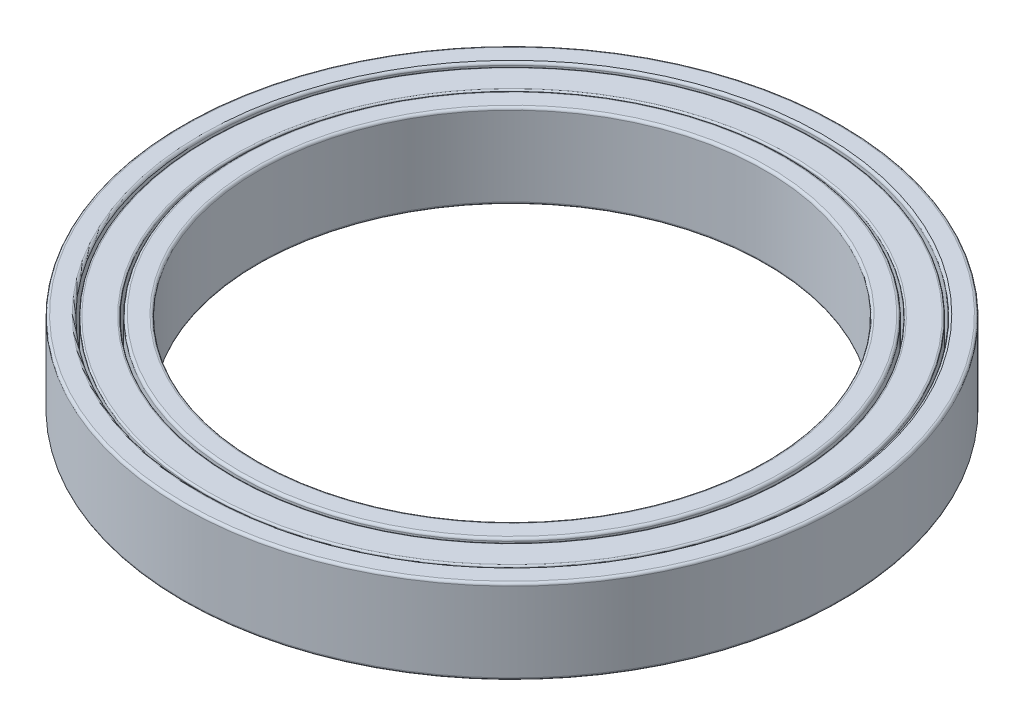
ISO-10303-21;
HEADER;
FILE_DESCRIPTION(('STEP AP214'),'2;1');
FILE_NAME('part.step','',(''),(''),'','','');
FILE_SCHEMA(('AUTOMOTIVE_DESIGN { 1 0 10303 214 1 1 1 1 }'));
ENDSEC;
DATA;
#1=APPLICATION_CONTEXT('core data for automotive mechanical design processes');
#2=APPLICATION_PROTOCOL_DEFINITION('international standard','automotive_design',2000,#1);
#3=PRODUCT_CONTEXT('',#1,'mechanical');
#4=PRODUCT('Part','Part','',(#3));
#5=PRODUCT_RELATED_PRODUCT_CATEGORY('part','',(#4));
#6=PRODUCT_DEFINITION_FORMATION('','',#4);
#7=PRODUCT_DEFINITION_CONTEXT('part definition',#1,'design');
#8=PRODUCT_DEFINITION('design','',#6,#7);
#9=PRODUCT_DEFINITION_SHAPE('','',#8);
#10=(LENGTH_UNIT() NAMED_UNIT(*) SI_UNIT(.MILLI.,.METRE.));
#11=(NAMED_UNIT(*) PLANE_ANGLE_UNIT() SI_UNIT($,.RADIAN.));
#12=(NAMED_UNIT(*) SI_UNIT($,.STERADIAN.) SOLID_ANGLE_UNIT());
#13=UNCERTAINTY_MEASURE_WITH_UNIT(LENGTH_MEASURE(1.E-05),#10,'distance_accuracy_value','');
#14=(GEOMETRIC_REPRESENTATION_CONTEXT(3) GLOBAL_UNCERTAINTY_ASSIGNED_CONTEXT((#13)) GLOBAL_UNIT_ASSIGNED_CONTEXT((#10,
#11,#12)) REPRESENTATION_CONTEXT('',''));
#15=CARTESIAN_POINT('',(0.,0.,0.));
#16=DIRECTION('',(0.,0.,1.));
#17=DIRECTION('',(1.,0.,0.));
#18=AXIS2_PLACEMENT_3D('',#15,#16,#17);
#19=CARTESIAN_POINT('',(0.,-102.389061915812,0.));
#20=DIRECTION('',(0.,1.,0.));
#21=DIRECTION('',(0.,0.,1.));
#22=AXIS2_PLACEMENT_3D('',#19,#20,#21);
#23=CYLINDRICAL_SURFACE('',#22,36.2);
#24=CARTESIAN_POINT('',(0.,0.399999999999998,0.));
#25=DIRECTION('',(0.,1.,0.));
#26=DIRECTION('',(0.,0.,1.));
#27=AXIS2_PLACEMENT_3D('',#24,#25,#26);
#28=CIRCLE('',#27,36.2);
#29=CARTESIAN_POINT('',(0.,0.399999999999998,36.2));
#30=VERTEX_POINT('',#29);
#31=EDGE_CURVE('E70',#30,#30,#28,.T.);
#32=ORIENTED_EDGE('',*,*,#31,.T.);
#33=EDGE_LOOP('',(#32));
#34=FACE_BOUND('',#33,.T.);
#35=CARTESIAN_POINT('',(0.,9.6,0.));
#36=DIRECTION('',(0.,1.,0.));
#37=DIRECTION('',(0.,0.,1.));
#38=AXIS2_PLACEMENT_3D('',#35,#36,#37);
#39=CIRCLE('',#38,36.2);
#40=CARTESIAN_POINT('',(0.,9.6,36.2));
#41=VERTEX_POINT('',#40);
#42=EDGE_CURVE('E74',#41,#41,#39,.F.);
#43=ORIENTED_EDGE('',*,*,#42,.T.);
#44=EDGE_LOOP('',(#43));
#45=FACE_BOUND('',#44,.T.);
#46=ADVANCED_FACE('F59',(#34,#45),#23,.T.);
#47=CARTESIAN_POINT('',(0.,9.8,0.));
#48=DIRECTION('',(0.,1.,0.));
#49=DIRECTION('',(0.,0.,1.));
#50=AXIS2_PLACEMENT_3D('',#47,#48,#49);
#51=PLANE('',#50);
#52=CARTESIAN_POINT('',(0.,9.8,0.));
#53=DIRECTION('',(0.,1.,0.));
#54=DIRECTION('',(0.,0.,1.));
#55=AXIS2_PLACEMENT_3D('',#52,#53,#54);
#56=CIRCLE('',#55,36.);
#57=CARTESIAN_POINT('',(0.,9.8,36.));
#58=VERTEX_POINT('',#57);
#59=EDGE_CURVE('E11',#58,#58,#56,.T.);
#60=ORIENTED_EDGE('',*,*,#59,.T.);
#61=EDGE_LOOP('',(#60));
#62=FACE_BOUND('',#61,.T.);
#63=CARTESIAN_POINT('',(0.,9.8,0.));
#64=DIRECTION('',(0.,1.,0.));
#65=DIRECTION('',(0.,0.,1.));
#66=AXIS2_PLACEMENT_3D('',#63,#64,#65);
#67=CIRCLE('',#66,33.);
#68=CARTESIAN_POINT('',(0.,9.8,33.));
#69=VERTEX_POINT('',#68);
#70=EDGE_CURVE('E66',#69,#69,#67,.F.);
#71=ORIENTED_EDGE('',*,*,#70,.T.);
#72=EDGE_LOOP('',(#71));
#73=FACE_BOUND('',#72,.T.);
#74=ADVANCED_FACE('F103',(#62,#73),#51,.T.);
#75=CARTESIAN_POINT('',(0.,-102.389061915812,0.));
#76=DIRECTION('',(0.,1.,0.));
#77=DIRECTION('',(0.,0.,1.));
#78=AXIS2_PLACEMENT_3D('',#75,#76,#77);
#79=CYLINDRICAL_SURFACE('',#78,32.8);
#80=CARTESIAN_POINT('',(0.,0.399999999999998,0.));
#81=DIRECTION('',(0.,1.,0.));
#82=DIRECTION('',(0.,0.,1.));
#83=AXIS2_PLACEMENT_3D('',#80,#81,#82);
#84=CIRCLE('',#83,32.8);
#85=CARTESIAN_POINT('',(0.,0.399999999999998,32.8));
#86=VERTEX_POINT('',#85);
#87=EDGE_CURVE('E85',#86,#86,#84,.F.);
#88=ORIENTED_EDGE('',*,*,#87,.T.);
#89=EDGE_LOOP('',(#88));
#90=FACE_BOUND('',#89,.T.);
#91=CARTESIAN_POINT('',(0.,9.6,0.));
#92=DIRECTION('',(0.,1.,0.));
#93=DIRECTION('',(0.,0.,1.));
#94=AXIS2_PLACEMENT_3D('',#91,#92,#93);
#95=CIRCLE('',#94,32.8);
#96=CARTESIAN_POINT('',(0.,9.6,32.8));
#97=VERTEX_POINT('',#96);
#98=EDGE_CURVE('E88',#97,#97,#95,.T.);
#99=ORIENTED_EDGE('',*,*,#98,.T.);
#100=EDGE_LOOP('',(#99));
#101=FACE_BOUND('',#100,.T.);
#102=ADVANCED_FACE('F92',(#90,#101),#79,.F.);
#103=CARTESIAN_POINT('',(0.,0.2,0.));
#104=DIRECTION('',(0.,1.,0.));
#105=DIRECTION('',(0.,0.,1.));
#106=AXIS2_PLACEMENT_3D('',#103,#104,#105);
#107=PLANE('',#106);
#108=CARTESIAN_POINT('',(0.,0.2,0.));
#109=DIRECTION('',(0.,1.,0.));
#110=DIRECTION('',(0.,0.,1.));
#111=AXIS2_PLACEMENT_3D('',#108,#109,#110);
#112=CIRCLE('',#111,33.);
#113=CARTESIAN_POINT('',(0.,0.2,33.));
#114=VERTEX_POINT('',#113);
#115=EDGE_CURVE('E79',#114,#114,#112,.T.);
#116=ORIENTED_EDGE('',*,*,#115,.T.);
#117=EDGE_LOOP('',(#116));
#118=FACE_BOUND('',#117,.T.);
#119=CARTESIAN_POINT('',(0.,0.2,0.));
#120=DIRECTION('',(0.,1.,0.));
#121=DIRECTION('',(0.,0.,1.));
#122=AXIS2_PLACEMENT_3D('',#119,#120,#121);
#123=CIRCLE('',#122,36.);
#124=CARTESIAN_POINT('',(0.,0.2,36.));
#125=VERTEX_POINT('',#124);
#126=EDGE_CURVE('E82',#125,#125,#123,.F.);
#127=ORIENTED_EDGE('',*,*,#126,.T.);
#128=EDGE_LOOP('',(#127));
#129=FACE_BOUND('',#128,.T.);
#130=ADVANCED_FACE('F117',(#118,#129),#107,.F.);
#131=CARTESIAN_POINT('',(0.,0.399999999999998,0.));
#132=DIRECTION('',(0.,1.,0.));
#133=DIRECTION('',(0.,0.,1.));
#134=AXIS2_PLACEMENT_3D('',#131,#132,#133);
#135=TOROIDAL_SURFACE('',#134,33.,0.2);
#136=ORIENTED_EDGE('',*,*,#115,.F.);
#137=EDGE_LOOP('',(#136));
#138=FACE_BOUND('',#137,.T.);
#139=ORIENTED_EDGE('',*,*,#87,.F.);
#140=EDGE_LOOP('',(#139));
#141=FACE_BOUND('',#140,.T.);
#142=ADVANCED_FACE('F114',(#138,#141),#135,.T.);
#143=CARTESIAN_POINT('',(0.,0.399999999999998,0.));
#144=DIRECTION('',(0.,1.,0.));
#145=DIRECTION('',(0.,0.,1.));
#146=AXIS2_PLACEMENT_3D('',#143,#144,#145);
#147=TOROIDAL_SURFACE('',#146,36.,0.2);
#148=ORIENTED_EDGE('',*,*,#31,.F.);
#149=EDGE_LOOP('',(#148));
#150=FACE_BOUND('',#149,.T.);
#151=ORIENTED_EDGE('',*,*,#126,.F.);
#152=EDGE_LOOP('',(#151));
#153=FACE_BOUND('',#152,.T.);
#154=ADVANCED_FACE('F100',(#150,#153),#147,.T.);
#155=CARTESIAN_POINT('',(0.,9.6,0.));
#156=DIRECTION('',(0.,1.,0.));
#157=DIRECTION('',(0.,0.,1.));
#158=AXIS2_PLACEMENT_3D('',#155,#156,#157);
#159=TOROIDAL_SURFACE('',#158,36.,0.2);
#160=ORIENTED_EDGE('',*,*,#42,.F.);
#161=EDGE_LOOP('',(#160));
#162=FACE_BOUND('',#161,.T.);
#163=ORIENTED_EDGE('',*,*,#59,.F.);
#164=EDGE_LOOP('',(#163));
#165=FACE_BOUND('',#164,.T.);
#166=ADVANCED_FACE('F95',(#162,#165),#159,.T.);
#167=CARTESIAN_POINT('',(0.,9.6,0.));
#168=DIRECTION('',(0.,1.,0.));
#169=DIRECTION('',(0.,0.,1.));
#170=AXIS2_PLACEMENT_3D('',#167,#168,#169);
#171=TOROIDAL_SURFACE('',#170,33.,0.2);
#172=ORIENTED_EDGE('',*,*,#70,.F.);
#173=EDGE_LOOP('',(#172));
#174=FACE_BOUND('',#173,.T.);
#175=ORIENTED_EDGE('',*,*,#98,.F.);
#176=EDGE_LOOP('',(#175));
#177=FACE_BOUND('',#176,.T.);
#178=ADVANCED_FACE('F61',(#174,#177),#171,.T.);
#179=CLOSED_SHELL('',(#46,#74,#102,#130,#142,#154,#166,#178));
#180=MANIFOLD_SOLID_BREP('B2',#179);
#181=CARTESIAN_POINT('',(0.,120.308657865101,0.));
#182=DIRECTION('',(0.,-1.,0.));
#183=DIRECTION('',(0.,0.,-1.));
#184=AXIS2_PLACEMENT_3D('',#181,#182,#183);
#185=CYLINDRICAL_SURFACE('',#184,39.);
#186=CARTESIAN_POINT('',(0.,0.299999999999995,0.));
#187=DIRECTION('',(0.,1.,0.));
#188=DIRECTION('',(0.,0.,1.));
#189=AXIS2_PLACEMENT_3D('',#186,#187,#188);
#190=CIRCLE('',#189,39.);
#191=CARTESIAN_POINT('',(0.,0.299999999999995,39.));
#192=VERTEX_POINT('',#191);
#193=EDGE_CURVE('E58',#192,#192,#190,.T.);
#194=ORIENTED_EDGE('',*,*,#193,.T.);
#195=EDGE_LOOP('',(#194));
#196=FACE_BOUND('',#195,.T.);
#197=CARTESIAN_POINT('',(0.,9.7,0.));
#198=DIRECTION('',(0.,1.,0.));
#199=DIRECTION('',(0.,0.,1.));
#200=AXIS2_PLACEMENT_3D('',#197,#198,#199);
#201=CIRCLE('',#200,39.);
#202=CARTESIAN_POINT('',(0.,9.7,39.));
#203=VERTEX_POINT('',#202);
#204=EDGE_CURVE('E232',#203,#203,#201,.F.);
#205=ORIENTED_EDGE('',*,*,#204,.T.);
#206=EDGE_LOOP('',(#205));
#207=FACE_BOUND('',#206,.T.);
#208=ADVANCED_FACE('F225',(#196,#207),#185,.T.);
#209=CARTESIAN_POINT('',(0.,0.,0.));
#210=DIRECTION('',(0.,1.,0.));
#211=DIRECTION('',(0.,0.,1.));
#212=AXIS2_PLACEMENT_3D('',#209,#210,#211);
#213=PLANE('',#212);
#214=CARTESIAN_POINT('',(0.,0.,0.));
#215=DIRECTION('',(0.,1.,0.));
#216=DIRECTION('',(0.,0.,1.));
#217=AXIS2_PLACEMENT_3D('',#214,#215,#216);
#218=CIRCLE('',#217,36.8);
#219=CARTESIAN_POINT('',(0.,0.,36.8));
#220=VERTEX_POINT('',#219);
#221=EDGE_CURVE('E251',#220,#220,#218,.T.);
#222=ORIENTED_EDGE('',*,*,#221,.T.);
#223=EDGE_LOOP('',(#222));
#224=FACE_BOUND('',#223,.T.);
#225=CARTESIAN_POINT('',(0.,0.,0.));
#226=DIRECTION('',(0.,1.,0.));
#227=DIRECTION('',(0.,0.,1.));
#228=AXIS2_PLACEMENT_3D('',#225,#226,#227);
#229=CIRCLE('',#228,38.7);
#230=CARTESIAN_POINT('',(0.,0.,38.7));
#231=VERTEX_POINT('',#230);
#232=EDGE_CURVE('E254',#231,#231,#229,.F.);
#233=ORIENTED_EDGE('',*,*,#232,.T.);
#234=EDGE_LOOP('',(#233));
#235=FACE_BOUND('',#234,.T.);
#236=ADVANCED_FACE('F258',(#224,#235),#213,.F.);
#237=CARTESIAN_POINT('',(0.,120.308657865101,0.));
#238=DIRECTION('',(0.,-1.,0.));
#239=DIRECTION('',(0.,0.,-1.));
#240=AXIS2_PLACEMENT_3D('',#237,#238,#239);
#241=CYLINDRICAL_SURFACE('',#240,36.5);
#242=CARTESIAN_POINT('',(0.,0.299999999999995,0.));
#243=DIRECTION('',(0.,1.,0.));
#244=DIRECTION('',(0.,0.,1.));
#245=AXIS2_PLACEMENT_3D('',#242,#243,#244);
#246=CIRCLE('',#245,36.5);
#247=CARTESIAN_POINT('',(0.,0.299999999999995,36.5));
#248=VERTEX_POINT('',#247);
#249=EDGE_CURVE('E245',#248,#248,#246,.F.);
#250=ORIENTED_EDGE('',*,*,#249,.T.);
#251=EDGE_LOOP('',(#250));
#252=FACE_BOUND('',#251,.T.);
#253=CARTESIAN_POINT('',(0.,9.7,0.));
#254=DIRECTION('',(0.,1.,0.));
#255=DIRECTION('',(0.,0.,1.));
#256=AXIS2_PLACEMENT_3D('',#253,#254,#255);
#257=CIRCLE('',#256,36.5);
#258=CARTESIAN_POINT('',(0.,9.7,36.5));
#259=VERTEX_POINT('',#258);
#260=EDGE_CURVE('E248',#259,#259,#257,.T.);
#261=ORIENTED_EDGE('',*,*,#260,.T.);
#262=EDGE_LOOP('',(#261));
#263=FACE_BOUND('',#262,.T.);
#264=ADVANCED_FACE('F278',(#252,#263),#241,.F.);
#265=CARTESIAN_POINT('',(0.,10.,0.));
#266=DIRECTION('',(0.,1.,0.));
#267=DIRECTION('',(0.,0.,1.));
#268=AXIS2_PLACEMENT_3D('',#265,#266,#267);
#269=PLANE('',#268);
#270=CARTESIAN_POINT('',(0.,10.,0.));
#271=DIRECTION('',(0.,1.,0.));
#272=DIRECTION('',(0.,0.,1.));
#273=AXIS2_PLACEMENT_3D('',#270,#271,#272);
#274=CIRCLE('',#273,36.8);
#275=CARTESIAN_POINT('',(0.,10.,36.8));
#276=VERTEX_POINT('',#275);
#277=EDGE_CURVE('E236',#276,#276,#274,.F.);
#278=ORIENTED_EDGE('',*,*,#277,.T.);
#279=EDGE_LOOP('',(#278));
#280=FACE_BOUND('',#279,.T.);
#281=CARTESIAN_POINT('',(0.,10.,0.));
#282=DIRECTION('',(0.,1.,0.));
#283=DIRECTION('',(0.,0.,1.));
#284=AXIS2_PLACEMENT_3D('',#281,#282,#283);
#285=CIRCLE('',#284,38.7);
#286=CARTESIAN_POINT('',(0.,10.,38.7));
#287=VERTEX_POINT('',#286);
#288=EDGE_CURVE('E240',#287,#287,#285,.T.);
#289=ORIENTED_EDGE('',*,*,#288,.T.);
#290=EDGE_LOOP('',(#289));
#291=FACE_BOUND('',#290,.T.);
#292=ADVANCED_FACE('F284',(#280,#291),#269,.T.);
#293=CARTESIAN_POINT('',(0.,0.299999999999995,0.));
#294=DIRECTION('',(0.,1.,0.));
#295=DIRECTION('',(0.,0.,1.));
#296=AXIS2_PLACEMENT_3D('',#293,#294,#295);
#297=TOROIDAL_SURFACE('',#296,36.8,0.3);
#298=ORIENTED_EDGE('',*,*,#249,.F.);
#299=EDGE_LOOP('',(#298));
#300=FACE_BOUND('',#299,.T.);
#301=ORIENTED_EDGE('',*,*,#221,.F.);
#302=EDGE_LOOP('',(#301));
#303=FACE_BOUND('',#302,.T.);
#304=ADVANCED_FACE('F269',(#300,#303),#297,.T.);
#305=CARTESIAN_POINT('',(0.,9.7,0.));
#306=DIRECTION('',(0.,1.,0.));
#307=DIRECTION('',(0.,0.,1.));
#308=AXIS2_PLACEMENT_3D('',#305,#306,#307);
#309=TOROIDAL_SURFACE('',#308,36.8,0.3);
#310=ORIENTED_EDGE('',*,*,#277,.F.);
#311=EDGE_LOOP('',(#310));
#312=FACE_BOUND('',#311,.T.);
#313=ORIENTED_EDGE('',*,*,#260,.F.);
#314=EDGE_LOOP('',(#313));
#315=FACE_BOUND('',#314,.T.);
#316=ADVANCED_FACE('F263',(#312,#315),#309,.T.);
#317=CARTESIAN_POINT('',(0.,0.299999999999995,0.));
#318=DIRECTION('',(0.,1.,0.));
#319=DIRECTION('',(0.,0.,1.));
#320=AXIS2_PLACEMENT_3D('',#317,#318,#319);
#321=TOROIDAL_SURFACE('',#320,38.7,0.3);
#322=ORIENTED_EDGE('',*,*,#232,.F.);
#323=EDGE_LOOP('',(#322));
#324=FACE_BOUND('',#323,.T.);
#325=ORIENTED_EDGE('',*,*,#193,.F.);
#326=EDGE_LOOP('',(#325));
#327=FACE_BOUND('',#326,.T.);
#328=ADVANCED_FACE('F260',(#324,#327),#321,.T.);
#329=CARTESIAN_POINT('',(0.,9.7,0.));
#330=DIRECTION('',(0.,1.,0.));
#331=DIRECTION('',(0.,0.,1.));
#332=AXIS2_PLACEMENT_3D('',#329,#330,#331);
#333=TOROIDAL_SURFACE('',#332,38.7,0.3);
#334=ORIENTED_EDGE('',*,*,#204,.F.);
#335=EDGE_LOOP('',(#334));
#336=FACE_BOUND('',#335,.T.);
#337=ORIENTED_EDGE('',*,*,#288,.F.);
#338=EDGE_LOOP('',(#337));
#339=FACE_BOUND('',#338,.T.);
#340=ADVANCED_FACE('F227',(#336,#339),#333,.T.);
#341=CLOSED_SHELL('',(#208,#236,#264,#292,#304,#316,#328,#340));
#342=MANIFOLD_SOLID_BREP('B6',#341);
#343=CARTESIAN_POINT('',(0.,10.,0.));
#344=DIRECTION('',(0.,1.,0.));
#345=DIRECTION('',(0.,0.,1.));
#346=AXIS2_PLACEMENT_3D('',#343,#344,#345);
#347=PLANE('',#346);
#348=CARTESIAN_POINT('',(0.,10.,0.));
#349=DIRECTION('',(0.,1.,0.));
#350=DIRECTION('',(0.,0.,1.));
#351=AXIS2_PLACEMENT_3D('',#348,#349,#350);
#352=CIRCLE('',#351,30.3);
#353=CARTESIAN_POINT('',(0.,10.,30.3));
#354=VERTEX_POINT('',#353);
#355=EDGE_CURVE('E224',#354,#354,#352,.F.);
#356=ORIENTED_EDGE('',*,*,#355,.T.);
#357=EDGE_LOOP('',(#356));
#358=FACE_BOUND('',#357,.T.);
#359=CARTESIAN_POINT('',(0.,10.,0.));
#360=DIRECTION('',(0.,1.,0.));
#361=DIRECTION('',(0.,0.,1.));
#362=AXIS2_PLACEMENT_3D('',#359,#360,#361);
#363=CIRCLE('',#362,32.2);
#364=CARTESIAN_POINT('',(0.,10.,32.2));
#365=VERTEX_POINT('',#364);
#366=EDGE_CURVE('E390',#365,#365,#363,.T.);
#367=ORIENTED_EDGE('',*,*,#366,.T.);
#368=EDGE_LOOP('',(#367));
#369=FACE_BOUND('',#368,.T.);
#370=ADVANCED_FACE('F383',(#358,#369),#347,.T.);
#371=CARTESIAN_POINT('',(0.,0.,0.));
#372=DIRECTION('',(0.,1.,0.));
#373=DIRECTION('',(0.,0.,1.));
#374=AXIS2_PLACEMENT_3D('',#371,#372,#373);
#375=PLANE('',#374);
#376=CARTESIAN_POINT('',(0.,0.,0.));
#377=DIRECTION('',(0.,1.,0.));
#378=DIRECTION('',(0.,0.,1.));
#379=AXIS2_PLACEMENT_3D('',#376,#377,#378);
#380=CIRCLE('',#379,30.3);
#381=CARTESIAN_POINT('',(0.,0.,30.3));
#382=VERTEX_POINT('',#381);
#383=EDGE_CURVE('E409',#382,#382,#380,.T.);
#384=ORIENTED_EDGE('',*,*,#383,.T.);
#385=EDGE_LOOP('',(#384));
#386=FACE_BOUND('',#385,.T.);
#387=CARTESIAN_POINT('',(0.,0.,0.));
#388=DIRECTION('',(0.,1.,0.));
#389=DIRECTION('',(0.,0.,1.));
#390=AXIS2_PLACEMENT_3D('',#387,#388,#389);
#391=CIRCLE('',#390,32.2);
#392=CARTESIAN_POINT('',(0.,0.,32.2));
#393=VERTEX_POINT('',#392);
#394=EDGE_CURVE('E412',#393,#393,#391,.F.);
#395=ORIENTED_EDGE('',*,*,#394,.T.);
#396=EDGE_LOOP('',(#395));
#397=FACE_BOUND('',#396,.T.);
#398=ADVANCED_FACE('F416',(#386,#397),#375,.F.);
#399=CARTESIAN_POINT('',(0.,10.,0.));
#400=DIRECTION('',(0.,-1.,0.));
#401=DIRECTION('',(0.,0.,-1.));
#402=AXIS2_PLACEMENT_3D('',#399,#400,#401);
#403=CYLINDRICAL_SURFACE('',#402,32.5);
#404=CARTESIAN_POINT('',(0.,0.3,0.));
#405=DIRECTION('',(0.,1.,0.));
#406=DIRECTION('',(0.,0.,1.));
#407=AXIS2_PLACEMENT_3D('',#404,#405,#406);
#408=CIRCLE('',#407,32.5);
#409=CARTESIAN_POINT('',(0.,0.3,32.5));
#410=VERTEX_POINT('',#409);
#411=EDGE_CURVE('E394',#410,#410,#408,.T.);
#412=ORIENTED_EDGE('',*,*,#411,.T.);
#413=EDGE_LOOP('',(#412));
#414=FACE_BOUND('',#413,.T.);
#415=CARTESIAN_POINT('',(0.,9.7,0.));
#416=DIRECTION('',(0.,1.,0.));
#417=DIRECTION('',(0.,0.,1.));
#418=AXIS2_PLACEMENT_3D('',#415,#416,#417);
#419=CIRCLE('',#418,32.5);
#420=CARTESIAN_POINT('',(0.,9.7,32.5));
#421=VERTEX_POINT('',#420);
#422=EDGE_CURVE('E398',#421,#421,#419,.F.);
#423=ORIENTED_EDGE('',*,*,#422,.T.);
#424=EDGE_LOOP('',(#423));
#425=FACE_BOUND('',#424,.T.);
#426=ADVANCED_FACE('F426',(#414,#425),#403,.T.);
#427=CARTESIAN_POINT('',(0.,10.,0.));
#428=DIRECTION('',(0.,-1.,0.));
#429=DIRECTION('',(0.,0.,-1.));
#430=AXIS2_PLACEMENT_3D('',#427,#428,#429);
#431=CYLINDRICAL_SURFACE('',#430,30.);
#432=CARTESIAN_POINT('',(0.,0.3,0.));
#433=DIRECTION('',(0.,1.,0.));
#434=DIRECTION('',(0.,0.,1.));
#435=AXIS2_PLACEMENT_3D('',#432,#433,#434);
#436=CIRCLE('',#435,30.);
#437=CARTESIAN_POINT('',(0.,0.3,30.));
#438=VERTEX_POINT('',#437);
#439=EDGE_CURVE('E403',#438,#438,#436,.F.);
#440=ORIENTED_EDGE('',*,*,#439,.T.);
#441=EDGE_LOOP('',(#440));
#442=FACE_BOUND('',#441,.T.);
#443=CARTESIAN_POINT('',(0.,9.7,0.));
#444=DIRECTION('',(0.,1.,0.));
#445=DIRECTION('',(0.,0.,1.));
#446=AXIS2_PLACEMENT_3D('',#443,#444,#445);
#447=CIRCLE('',#446,30.);
#448=CARTESIAN_POINT('',(0.,9.7,30.));
#449=VERTEX_POINT('',#448);
#450=EDGE_CURVE('E406',#449,#449,#447,.T.);
#451=ORIENTED_EDGE('',*,*,#450,.T.);
#452=EDGE_LOOP('',(#451));
#453=FACE_BOUND('',#452,.T.);
#454=ADVANCED_FACE('F429',(#442,#453),#431,.F.);
#455=CARTESIAN_POINT('',(0.,0.3,0.));
#456=DIRECTION('',(0.,1.,0.));
#457=DIRECTION('',(0.,0.,1.));
#458=AXIS2_PLACEMENT_3D('',#455,#456,#457);
#459=TOROIDAL_SURFACE('',#458,30.3,0.3);
#460=ORIENTED_EDGE('',*,*,#439,.F.);
#461=EDGE_LOOP('',(#460));
#462=FACE_BOUND('',#461,.T.);
#463=ORIENTED_EDGE('',*,*,#383,.F.);
#464=EDGE_LOOP('',(#463));
#465=FACE_BOUND('',#464,.T.);
#466=ADVANCED_FACE('F422',(#462,#465),#459,.T.);
#467=CARTESIAN_POINT('',(0.,0.3,0.));
#468=DIRECTION('',(0.,1.,0.));
#469=DIRECTION('',(0.,0.,1.));
#470=AXIS2_PLACEMENT_3D('',#467,#468,#469);
#471=TOROIDAL_SURFACE('',#470,32.2,0.3);
#472=ORIENTED_EDGE('',*,*,#394,.F.);
#473=EDGE_LOOP('',(#472));
#474=FACE_BOUND('',#473,.T.);
#475=ORIENTED_EDGE('',*,*,#411,.F.);
#476=EDGE_LOOP('',(#475));
#477=FACE_BOUND('',#476,.T.);
#478=ADVANCED_FACE('F418',(#474,#477),#471,.T.);
#479=CARTESIAN_POINT('',(0.,9.7,0.));
#480=DIRECTION('',(0.,1.,0.));
#481=DIRECTION('',(0.,0.,1.));
#482=AXIS2_PLACEMENT_3D('',#479,#480,#481);
#483=TOROIDAL_SURFACE('',#482,30.3,0.3);
#484=ORIENTED_EDGE('',*,*,#355,.F.);
#485=EDGE_LOOP('',(#484));
#486=FACE_BOUND('',#485,.T.);
#487=ORIENTED_EDGE('',*,*,#450,.F.);
#488=EDGE_LOOP('',(#487));
#489=FACE_BOUND('',#488,.T.);
#490=ADVANCED_FACE('F421',(#486,#489),#483,.T.);
#491=CARTESIAN_POINT('',(0.,9.7,0.));
#492=DIRECTION('',(0.,1.,0.));
#493=DIRECTION('',(0.,0.,1.));
#494=AXIS2_PLACEMENT_3D('',#491,#492,#493);
#495=TOROIDAL_SURFACE('',#494,32.2,0.3);
#496=ORIENTED_EDGE('',*,*,#422,.F.);
#497=EDGE_LOOP('',(#496));
#498=FACE_BOUND('',#497,.T.);
#499=ORIENTED_EDGE('',*,*,#366,.F.);
#500=EDGE_LOOP('',(#499));
#501=FACE_BOUND('',#500,.T.);
#502=ADVANCED_FACE('F385',(#498,#501),#495,.T.);
#503=CLOSED_SHELL('',(#370,#398,#426,#454,#466,#478,#490,#502));
#504=MANIFOLD_SOLID_BREP('B53',#503);
#505=ADVANCED_BREP_SHAPE_REPRESENTATION('',(#18,#180,#342,#504),#14);
#506=SHAPE_DEFINITION_REPRESENTATION(#9,#505);
ENDSEC;
END-ISO-10303-21;
